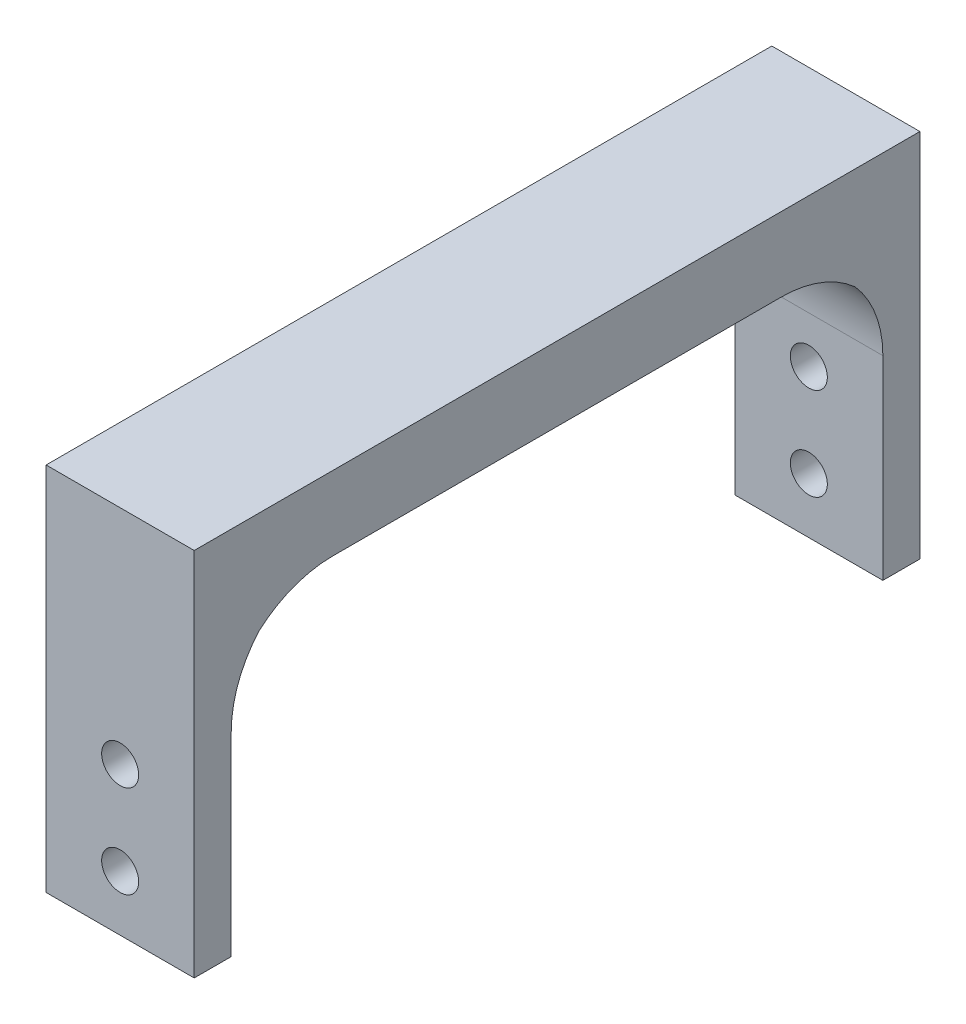
ISO-10303-21;
HEADER;
FILE_DESCRIPTION(('STEP AP214'),'2;1');
FILE_NAME('part.step','',(''),(''),'','','');
FILE_SCHEMA(('AUTOMOTIVE_DESIGN { 1 0 10303 214 1 1 1 1 }'));
ENDSEC;
DATA;
#1=APPLICATION_CONTEXT('core data for automotive mechanical design processes');
#2=APPLICATION_PROTOCOL_DEFINITION('international standard','automotive_design',2000,#1);
#3=PRODUCT_CONTEXT('',#1,'mechanical');
#4=PRODUCT('Part','Part','',(#3));
#5=PRODUCT_RELATED_PRODUCT_CATEGORY('part','',(#4));
#6=PRODUCT_DEFINITION_FORMATION('','',#4);
#7=PRODUCT_DEFINITION_CONTEXT('part definition',#1,'design');
#8=PRODUCT_DEFINITION('design','',#6,#7);
#9=PRODUCT_DEFINITION_SHAPE('','',#8);
#10=(LENGTH_UNIT() NAMED_UNIT(*) SI_UNIT(.MILLI.,.METRE.));
#11=(NAMED_UNIT(*) PLANE_ANGLE_UNIT() SI_UNIT($,.RADIAN.));
#12=(NAMED_UNIT(*) SI_UNIT($,.STERADIAN.) SOLID_ANGLE_UNIT());
#13=UNCERTAINTY_MEASURE_WITH_UNIT(LENGTH_MEASURE(1.E-05),#10,'distance_accuracy_value','');
#14=(GEOMETRIC_REPRESENTATION_CONTEXT(3) GLOBAL_UNCERTAINTY_ASSIGNED_CONTEXT((#13)) GLOBAL_UNIT_ASSIGNED_CONTEXT((#10,
#11,#12)) REPRESENTATION_CONTEXT('',''));
#15=CARTESIAN_POINT('',(0.,0.,0.));
#16=DIRECTION('',(0.,0.,1.));
#17=DIRECTION('',(1.,0.,0.));
#18=AXIS2_PLACEMENT_3D('',#15,#16,#17);
#19=CARTESIAN_POINT('',(0.,40.,93.));
#20=DIRECTION('',(0.,1.,0.));
#21=DIRECTION('',(0.,0.,1.));
#22=AXIS2_PLACEMENT_3D('',#19,#20,#21);
#23=PLANE('',#22);
#24=DIRECTION('',(0.,0.,-1.));
#25=VECTOR('',#24,1.);
#26=CARTESIAN_POINT('',(3.49999999999999,40.,93.));
#27=LINE('',#26,#25);
#28=CARTESIAN_POINT('',(3.49999999999999,40.,79.2867965644036));
#29=VERTEX_POINT('',#28);
#30=CARTESIAN_POINT('',(3.49999999999999,40.,18.7132034355964));
#31=VERTEX_POINT('',#30);
#32=EDGE_CURVE('E226',#29,#31,#27,.T.);
#33=ORIENTED_EDGE('',*,*,#32,.F.);
#34=DIRECTION('',(1.,0.,0.));
#35=VECTOR('',#34,1.);
#36=CARTESIAN_POINT('',(0.,40.,79.2867965644036));
#37=LINE('',#36,#35);
#38=CARTESIAN_POINT('',(0.,40.,79.2867965644036));
#39=VERTEX_POINT('',#38);
#40=EDGE_CURVE('E374',#29,#39,#37,.F.);
#41=ORIENTED_EDGE('',*,*,#40,.T.);
#42=DIRECTION('',(0.,0.,-1.));
#43=VECTOR('',#42,1.);
#44=CARTESIAN_POINT('',(0.,40.,93.));
#45=LINE('',#44,#43);
#46=CARTESIAN_POINT('',(0.,40.,18.7132034355964));
#47=VERTEX_POINT('',#46);
#48=EDGE_CURVE('E321',#39,#47,#45,.T.);
#49=ORIENTED_EDGE('',*,*,#48,.T.);
#50=DIRECTION('',(1.,0.,0.));
#51=VECTOR('',#50,1.);
#52=CARTESIAN_POINT('',(0.,40.,18.7132034355964));
#53=LINE('',#52,#51);
#54=EDGE_CURVE('E277',#47,#31,#53,.T.);
#55=ORIENTED_EDGE('',*,*,#54,.T.);
#56=EDGE_LOOP('',(#33,#41,#49,#55));
#57=FACE_BOUND('',#56,.T.);
#58=ADVANCED_FACE('F33',(#57),#23,.F.);
#59=CARTESIAN_POINT('',(0.,0.,5.));
#60=DIRECTION('',(0.,0.,-1.));
#61=DIRECTION('',(-1.,0.,0.));
#62=AXIS2_PLACEMENT_3D('',#59,#60,#61);
#63=PLANE('',#62);
#64=CARTESIAN_POINT('',(10.,7.5,5.));
#65=DIRECTION('',(0.,0.,-1.));
#66=DIRECTION('',(-1.,0.,0.));
#67=AXIS2_PLACEMENT_3D('',#64,#65,#66);
#68=CIRCLE('',#67,2.5);
#69=CARTESIAN_POINT('',(7.5,7.5,5.));
#70=VERTEX_POINT('',#69);
#71=EDGE_CURVE('E355',#70,#70,#68,.T.);
#72=ORIENTED_EDGE('',*,*,#71,.T.);
#73=EDGE_LOOP('',(#72));
#74=FACE_BOUND('',#73,.T.);
#75=CARTESIAN_POINT('',(10.,20.,5.));
#76=DIRECTION('',(0.,0.,-1.));
#77=DIRECTION('',(-1.,0.,0.));
#78=AXIS2_PLACEMENT_3D('',#75,#76,#77);
#79=CIRCLE('',#78,2.5);
#80=CARTESIAN_POINT('',(7.5,20.,5.));
#81=VERTEX_POINT('',#80);
#82=EDGE_CURVE('E533',#81,#81,#79,.T.);
#83=ORIENTED_EDGE('',*,*,#82,.T.);
#84=EDGE_LOOP('',(#83));
#85=FACE_BOUND('',#84,.T.);
#86=DIRECTION('',(0.,1.,0.));
#87=VECTOR('',#86,1.);
#88=CARTESIAN_POINT('',(20.,0.,5.));
#89=LINE('',#88,#87);
#90=CARTESIAN_POINT('',(20.,0.,5.));
#91=VERTEX_POINT('',#90);
#92=CARTESIAN_POINT('',(20.,26.2867965644036,5.));
#93=VERTEX_POINT('',#92);
#94=EDGE_CURVE('E334',#91,#93,#89,.T.);
#95=ORIENTED_EDGE('',*,*,#94,.T.);
#96=DIRECTION('',(1.,0.,0.));
#97=VECTOR('',#96,1.);
#98=CARTESIAN_POINT('',(0.,26.2867965644036,5.));
#99=LINE('',#98,#97);
#100=CARTESIAN_POINT('',(0.,26.2867965644036,5.));
#101=VERTEX_POINT('',#100);
#102=EDGE_CURVE('E343',#93,#101,#99,.F.);
#103=ORIENTED_EDGE('',*,*,#102,.T.);
#104=DIRECTION('',(0.,-1.,0.));
#105=VECTOR('',#104,1.);
#106=CARTESIAN_POINT('',(0.,0.,5.));
#107=LINE('',#106,#105);
#108=CARTESIAN_POINT('',(0.,0.,5.));
#109=VERTEX_POINT('',#108);
#110=EDGE_CURVE('E339',#101,#109,#107,.T.);
#111=ORIENTED_EDGE('',*,*,#110,.T.);
#112=DIRECTION('',(1.,0.,0.));
#113=VECTOR('',#112,1.);
#114=CARTESIAN_POINT('',(0.,0.,5.));
#115=LINE('',#114,#113);
#116=EDGE_CURVE('E341',#109,#91,#115,.T.);
#117=ORIENTED_EDGE('',*,*,#116,.T.);
#118=EDGE_LOOP('',(#95,#103,#111,#117));
#119=FACE_BOUND('',#118,.T.);
#120=ADVANCED_FACE('F449',(#74,#85,#119),#63,.F.);
#121=CARTESIAN_POINT('',(0.,0.,5.));
#122=DIRECTION('',(1.,0.,0.));
#123=DIRECTION('',(0.,1.,0.));
#124=AXIS2_PLACEMENT_3D('',#121,#122,#123);
#125=PLANE('',#124);
#126=CARTESIAN_POINT('',(0.,26.2867965644036,20.));
#127=DIRECTION('',(1.,0.,0.));
#128=DIRECTION('',(0.,1.,0.));
#129=AXIS2_PLACEMENT_3D('',#126,#127,#128);
#130=CIRCLE('',#129,15.);
#131=CARTESIAN_POINT('',(0.,36.2304676902326,8.76953230976757));
#132=VERTEX_POINT('',#131);
#133=EDGE_CURVE('E284',#101,#132,#130,.T.);
#134=ORIENTED_EDGE('',*,*,#133,.T.);
#135=CARTESIAN_POINT('',(0.,25.,18.7132034355964));
#136=DIRECTION('',(1.,0.,0.));
#137=DIRECTION('',(0.,1.,0.));
#138=AXIS2_PLACEMENT_3D('',#135,#136,#137);
#139=CIRCLE('',#138,15.);
#140=EDGE_CURVE('E288',#132,#47,#139,.T.);
#141=ORIENTED_EDGE('',*,*,#140,.T.);
#142=ORIENTED_EDGE('',*,*,#48,.F.);
#143=CARTESIAN_POINT('',(0.,25.,79.2867965644036));
#144=DIRECTION('',(1.,0.,0.));
#145=DIRECTION('',(0.,1.,0.));
#146=AXIS2_PLACEMENT_3D('',#143,#144,#145);
#147=CIRCLE('',#146,15.);
#148=CARTESIAN_POINT('',(0.,36.2304676902325,89.2304676902325));
#149=VERTEX_POINT('',#148);
#150=EDGE_CURVE('E11',#39,#149,#147,.T.);
#151=ORIENTED_EDGE('',*,*,#150,.T.);
#152=CARTESIAN_POINT('',(0.,26.2867965644036,78.));
#153=DIRECTION('',(1.,0.,0.));
#154=DIRECTION('',(0.,1.,0.));
#155=AXIS2_PLACEMENT_3D('',#152,#153,#154);
#156=CIRCLE('',#155,15.);
#157=CARTESIAN_POINT('',(0.,26.2867965644036,93.));
#158=VERTEX_POINT('',#157);
#159=EDGE_CURVE('E292',#149,#158,#156,.T.);
#160=ORIENTED_EDGE('',*,*,#159,.T.);
#161=DIRECTION('',(0.,-1.,0.));
#162=VECTOR('',#161,1.);
#163=CARTESIAN_POINT('',(0.,50.,93.));
#164=LINE('',#163,#162);
#165=CARTESIAN_POINT('',(0.,0.,93.));
#166=VERTEX_POINT('',#165);
#167=EDGE_CURVE('E254',#158,#166,#164,.T.);
#168=ORIENTED_EDGE('',*,*,#167,.T.);
#169=DIRECTION('',(0.,0.,-1.));
#170=VECTOR('',#169,1.);
#171=CARTESIAN_POINT('',(0.,0.,98.));
#172=LINE('',#171,#170);
#173=CARTESIAN_POINT('',(0.,0.,98.));
#174=VERTEX_POINT('',#173);
#175=EDGE_CURVE('E322',#174,#166,#172,.T.);
#176=ORIENTED_EDGE('',*,*,#175,.F.);
#177=DIRECTION('',(0.,-1.,0.));
#178=VECTOR('',#177,1.);
#179=CARTESIAN_POINT('',(0.,50.,98.));
#180=LINE('',#179,#178);
#181=CARTESIAN_POINT('',(0.,50.,98.));
#182=VERTEX_POINT('',#181);
#183=EDGE_CURVE('E257',#182,#174,#180,.T.);
#184=ORIENTED_EDGE('',*,*,#183,.F.);
#185=DIRECTION('',(0.,0.,-1.));
#186=VECTOR('',#185,1.);
#187=CARTESIAN_POINT('',(0.,50.,5.));
#188=LINE('',#187,#186);
#189=CARTESIAN_POINT('',(0.,50.,0.));
#190=VERTEX_POINT('',#189);
#191=EDGE_CURVE('E360',#182,#190,#188,.T.);
#192=ORIENTED_EDGE('',*,*,#191,.T.);
#193=DIRECTION('',(0.,-1.,0.));
#194=VECTOR('',#193,1.);
#195=CARTESIAN_POINT('',(0.,0.,0.));
#196=LINE('',#195,#194);
#197=CARTESIAN_POINT('',(0.,0.,0.));
#198=VERTEX_POINT('',#197);
#199=EDGE_CURVE('E351',#190,#198,#196,.T.);
#200=ORIENTED_EDGE('',*,*,#199,.T.);
#201=DIRECTION('',(0.,0.,-1.));
#202=VECTOR('',#201,1.);
#203=CARTESIAN_POINT('',(0.,0.,5.));
#204=LINE('',#203,#202);
#205=EDGE_CURVE('E368',#109,#198,#204,.T.);
#206=ORIENTED_EDGE('',*,*,#205,.F.);
#207=ORIENTED_EDGE('',*,*,#110,.F.);
#208=EDGE_LOOP('',(#134,#141,#142,#151,#160,#168,#176,#184,#192,#200,#206,#207));
#209=FACE_BOUND('',#208,.T.);
#210=ADVANCED_FACE('F454',(#209),#125,.F.);
#211=CARTESIAN_POINT('',(0.,0.,5.));
#212=DIRECTION('',(0.,1.,0.));
#213=DIRECTION('',(0.,0.,1.));
#214=AXIS2_PLACEMENT_3D('',#211,#212,#213);
#215=PLANE('',#214);
#216=DIRECTION('',(1.,0.,0.));
#217=VECTOR('',#216,1.);
#218=CARTESIAN_POINT('',(0.,0.,0.));
#219=LINE('',#218,#217);
#220=CARTESIAN_POINT('',(20.,0.,0.));
#221=VERTEX_POINT('',#220);
#222=EDGE_CURVE('E354',#198,#221,#219,.T.);
#223=ORIENTED_EDGE('',*,*,#222,.T.);
#224=DIRECTION('',(0.,0.,-1.));
#225=VECTOR('',#224,1.);
#226=CARTESIAN_POINT('',(20.,0.,5.));
#227=LINE('',#226,#225);
#228=EDGE_CURVE('E366',#91,#221,#227,.T.);
#229=ORIENTED_EDGE('',*,*,#228,.F.);
#230=ORIENTED_EDGE('',*,*,#116,.F.);
#231=ORIENTED_EDGE('',*,*,#205,.T.);
#232=EDGE_LOOP('',(#223,#229,#230,#231));
#233=FACE_BOUND('',#232,.T.);
#234=ADVANCED_FACE('F489',(#233),#215,.F.);
#235=CARTESIAN_POINT('',(20.,0.,5.));
#236=DIRECTION('',(-1.,0.,0.));
#237=DIRECTION('',(0.,-1.,0.));
#238=AXIS2_PLACEMENT_3D('',#235,#236,#237);
#239=PLANE('',#238);
#240=CARTESIAN_POINT('',(20.,26.2867965644036,78.));
#241=DIRECTION('',(-1.,0.,0.));
#242=DIRECTION('',(0.,-1.,0.));
#243=AXIS2_PLACEMENT_3D('',#240,#241,#242);
#244=CIRCLE('',#243,15.);
#245=CARTESIAN_POINT('',(20.,26.2867965644036,93.));
#246=VERTEX_POINT('',#245);
#247=CARTESIAN_POINT('',(20.,36.2304676902325,89.2304676902325));
#248=VERTEX_POINT('',#247);
#249=EDGE_CURVE('E290',#246,#248,#244,.T.);
#250=ORIENTED_EDGE('',*,*,#249,.T.);
#251=CARTESIAN_POINT('',(20.,25.,79.2867965644036));
#252=DIRECTION('',(-1.,0.,0.));
#253=DIRECTION('',(0.,-1.,0.));
#254=AXIS2_PLACEMENT_3D('',#251,#252,#253);
#255=CIRCLE('',#254,15.);
#256=CARTESIAN_POINT('',(20.,40.,79.2867965644036));
#257=VERTEX_POINT('',#256);
#258=EDGE_CURVE('E42',#248,#257,#255,.T.);
#259=ORIENTED_EDGE('',*,*,#258,.T.);
#260=DIRECTION('',(0.,0.,-1.));
#261=VECTOR('',#260,1.);
#262=CARTESIAN_POINT('',(20.,40.,93.));
#263=LINE('',#262,#261);
#264=CARTESIAN_POINT('',(20.,40.,18.7132034355964));
#265=VERTEX_POINT('',#264);
#266=EDGE_CURVE('E314',#257,#265,#263,.T.);
#267=ORIENTED_EDGE('',*,*,#266,.T.);
#268=CARTESIAN_POINT('',(20.,25.,18.7132034355964));
#269=DIRECTION('',(-1.,0.,0.));
#270=DIRECTION('',(0.,-1.,0.));
#271=AXIS2_PLACEMENT_3D('',#268,#269,#270);
#272=CIRCLE('',#271,15.);
#273=CARTESIAN_POINT('',(20.,36.2304676902326,8.76953230976757));
#274=VERTEX_POINT('',#273);
#275=EDGE_CURVE('E286',#265,#274,#272,.T.);
#276=ORIENTED_EDGE('',*,*,#275,.T.);
#277=CARTESIAN_POINT('',(20.,26.2867965644036,20.));
#278=DIRECTION('',(-1.,0.,0.));
#279=DIRECTION('',(0.,-1.,0.));
#280=AXIS2_PLACEMENT_3D('',#277,#278,#279);
#281=CIRCLE('',#280,15.);
#282=EDGE_CURVE('E282',#274,#93,#281,.T.);
#283=ORIENTED_EDGE('',*,*,#282,.T.);
#284=ORIENTED_EDGE('',*,*,#94,.F.);
#285=ORIENTED_EDGE('',*,*,#228,.T.);
#286=DIRECTION('',(0.,1.,0.));
#287=VECTOR('',#286,1.);
#288=CARTESIAN_POINT('',(20.,0.,0.));
#289=LINE('',#288,#287);
#290=CARTESIAN_POINT('',(20.,50.,0.));
#291=VERTEX_POINT('',#290);
#292=EDGE_CURVE('E357',#221,#291,#289,.T.);
#293=ORIENTED_EDGE('',*,*,#292,.T.);
#294=DIRECTION('',(0.,0.,-1.));
#295=VECTOR('',#294,1.);
#296=CARTESIAN_POINT('',(20.,50.,5.));
#297=LINE('',#296,#295);
#298=CARTESIAN_POINT('',(20.,50.,98.));
#299=VERTEX_POINT('',#298);
#300=EDGE_CURVE('E363',#299,#291,#297,.T.);
#301=ORIENTED_EDGE('',*,*,#300,.F.);
#302=DIRECTION('',(0.,1.,0.));
#303=VECTOR('',#302,1.);
#304=CARTESIAN_POINT('',(20.,50.,98.));
#305=LINE('',#304,#303);
#306=CARTESIAN_POINT('',(20.,0.,98.));
#307=VERTEX_POINT('',#306);
#308=EDGE_CURVE('E263',#307,#299,#305,.T.);
#309=ORIENTED_EDGE('',*,*,#308,.F.);
#310=DIRECTION('',(0.,0.,-1.));
#311=VECTOR('',#310,1.);
#312=CARTESIAN_POINT('',(20.,0.,98.));
#313=LINE('',#312,#311);
#314=CARTESIAN_POINT('',(20.,0.,93.));
#315=VERTEX_POINT('',#314);
#316=EDGE_CURVE('E269',#307,#315,#313,.T.);
#317=ORIENTED_EDGE('',*,*,#316,.T.);
#318=DIRECTION('',(0.,1.,0.));
#319=VECTOR('',#318,1.);
#320=CARTESIAN_POINT('',(20.,50.,93.));
#321=LINE('',#320,#319);
#322=EDGE_CURVE('E261',#315,#246,#321,.T.);
#323=ORIENTED_EDGE('',*,*,#322,.T.);
#324=EDGE_LOOP('',(#250,#259,#267,#276,#283,#284,#285,#293,#301,#309,#317,#323));
#325=FACE_BOUND('',#324,.T.);
#326=ADVANCED_FACE('F313',(#325),#239,.F.);
#327=CARTESIAN_POINT('',(0.,50.,5.));
#328=DIRECTION('',(0.,-1.,0.));
#329=DIRECTION('',(0.,0.,-1.));
#330=AXIS2_PLACEMENT_3D('',#327,#328,#329);
#331=PLANE('',#330);
#332=DIRECTION('',(-1.,0.,0.));
#333=VECTOR('',#332,1.);
#334=CARTESIAN_POINT('',(0.,50.,0.));
#335=LINE('',#334,#333);
#336=EDGE_CURVE('E342',#291,#190,#335,.T.);
#337=ORIENTED_EDGE('',*,*,#336,.T.);
#338=ORIENTED_EDGE('',*,*,#191,.F.);
#339=DIRECTION('',(-1.,0.,0.));
#340=VECTOR('',#339,1.);
#341=CARTESIAN_POINT('',(0.,50.,98.));
#342=LINE('',#341,#340);
#343=EDGE_CURVE('E266',#299,#182,#342,.T.);
#344=ORIENTED_EDGE('',*,*,#343,.F.);
#345=ORIENTED_EDGE('',*,*,#300,.T.);
#346=EDGE_LOOP('',(#337,#338,#344,#345));
#347=FACE_BOUND('',#346,.T.);
#348=ADVANCED_FACE('F482',(#347),#331,.F.);
#349=CARTESIAN_POINT('',(0.,0.,0.));
#350=DIRECTION('',(0.,0.,-1.));
#351=DIRECTION('',(-1.,0.,0.));
#352=AXIS2_PLACEMENT_3D('',#349,#350,#351);
#353=PLANE('',#352);
#354=CARTESIAN_POINT('',(10.,20.,0.));
#355=DIRECTION('',(0.,0.,-1.));
#356=DIRECTION('',(-1.,0.,0.));
#357=AXIS2_PLACEMENT_3D('',#354,#355,#356);
#358=CIRCLE('',#357,2.5);
#359=CARTESIAN_POINT('',(7.5,20.,0.));
#360=VERTEX_POINT('',#359);
#361=EDGE_CURVE('E325',#360,#360,#358,.T.);
#362=ORIENTED_EDGE('',*,*,#361,.F.);
#363=EDGE_LOOP('',(#362));
#364=FACE_BOUND('',#363,.T.);
#365=CARTESIAN_POINT('',(10.,7.5,0.));
#366=DIRECTION('',(0.,0.,-1.));
#367=DIRECTION('',(-1.,0.,0.));
#368=AXIS2_PLACEMENT_3D('',#365,#366,#367);
#369=CIRCLE('',#368,2.5);
#370=CARTESIAN_POINT('',(7.5,7.5,0.));
#371=VERTEX_POINT('',#370);
#372=EDGE_CURVE('E347',#371,#371,#369,.T.);
#373=ORIENTED_EDGE('',*,*,#372,.F.);
#374=EDGE_LOOP('',(#373));
#375=FACE_BOUND('',#374,.T.);
#376=ORIENTED_EDGE('',*,*,#199,.F.);
#377=ORIENTED_EDGE('',*,*,#336,.F.);
#378=ORIENTED_EDGE('',*,*,#292,.F.);
#379=ORIENTED_EDGE('',*,*,#222,.F.);
#380=EDGE_LOOP('',(#376,#377,#378,#379));
#381=FACE_BOUND('',#380,.T.);
#382=ADVANCED_FACE('F474',(#364,#375,#381),#353,.T.);
#383=CARTESIAN_POINT('',(10.,7.5,5.));
#384=DIRECTION('',(0.,0.,-1.));
#385=DIRECTION('',(-1.,0.,0.));
#386=AXIS2_PLACEMENT_3D('',#383,#384,#385);
#387=CYLINDRICAL_SURFACE('',#386,2.5);
#388=ORIENTED_EDGE('',*,*,#71,.F.);
#389=EDGE_LOOP('',(#388));
#390=FACE_BOUND('',#389,.T.);
#391=ORIENTED_EDGE('',*,*,#372,.T.);
#392=EDGE_LOOP('',(#391));
#393=FACE_BOUND('',#392,.T.);
#394=ADVANCED_FACE('F469',(#390,#393),#387,.F.);
#395=CARTESIAN_POINT('',(10.,20.,5.));
#396=DIRECTION('',(0.,0.,-1.));
#397=DIRECTION('',(-1.,0.,0.));
#398=AXIS2_PLACEMENT_3D('',#395,#396,#397);
#399=CYLINDRICAL_SURFACE('',#398,2.5);
#400=ORIENTED_EDGE('',*,*,#82,.F.);
#401=EDGE_LOOP('',(#400));
#402=FACE_BOUND('',#401,.T.);
#403=ORIENTED_EDGE('',*,*,#361,.T.);
#404=EDGE_LOOP('',(#403));
#405=FACE_BOUND('',#404,.T.);
#406=ADVANCED_FACE('F461',(#402,#405),#399,.F.);
#407=CARTESIAN_POINT('',(16.5,40.,79.2867965644036));
#408=VERTEX_POINT('',#407);
#409=EDGE_CURVE('E309',#257,#408,#37,.F.);
#410=ORIENTED_EDGE('',*,*,#409,.T.);
#411=DIRECTION('',(0.,0.,-1.));
#412=VECTOR('',#411,1.);
#413=CARTESIAN_POINT('',(16.5,40.,5.));
#414=LINE('',#413,#412);
#415=CARTESIAN_POINT('',(16.5,40.,18.7132034355964));
#416=VERTEX_POINT('',#415);
#417=EDGE_CURVE('E223',#408,#416,#414,.T.);
#418=ORIENTED_EDGE('',*,*,#417,.T.);
#419=EDGE_CURVE('E320',#416,#265,#53,.T.);
#420=ORIENTED_EDGE('',*,*,#419,.T.);
#421=ORIENTED_EDGE('',*,*,#266,.F.);
#422=EDGE_LOOP('',(#410,#418,#420,#421));
#423=FACE_BOUND('',#422,.T.);
#424=ADVANCED_FACE('F318',(#423),#23,.F.);
#425=CARTESIAN_POINT('',(0.,0.,93.));
#426=DIRECTION('',(0.,0.,1.));
#427=DIRECTION('',(1.,0.,0.));
#428=AXIS2_PLACEMENT_3D('',#425,#426,#427);
#429=PLANE('',#428);
#430=CARTESIAN_POINT('',(9.99999999999998,20.,93.));
#431=DIRECTION('',(0.,0.,1.));
#432=DIRECTION('',(1.,0.,0.));
#433=AXIS2_PLACEMENT_3D('',#430,#431,#432);
#434=CIRCLE('',#433,2.5);
#435=CARTESIAN_POINT('',(12.5,20.,93.));
#436=VERTEX_POINT('',#435);
#437=EDGE_CURVE('E243',#436,#436,#434,.T.);
#438=ORIENTED_EDGE('',*,*,#437,.T.);
#439=EDGE_LOOP('',(#438));
#440=FACE_BOUND('',#439,.T.);
#441=CARTESIAN_POINT('',(9.99999999999999,7.5,93.));
#442=DIRECTION('',(0.,0.,1.));
#443=DIRECTION('',(1.,0.,0.));
#444=AXIS2_PLACEMENT_3D('',#441,#442,#443);
#445=CIRCLE('',#444,2.5);
#446=CARTESIAN_POINT('',(12.5,7.5,93.));
#447=VERTEX_POINT('',#446);
#448=EDGE_CURVE('E251',#447,#447,#445,.T.);
#449=ORIENTED_EDGE('',*,*,#448,.T.);
#450=EDGE_LOOP('',(#449));
#451=FACE_BOUND('',#450,.T.);
#452=ORIENTED_EDGE('',*,*,#167,.F.);
#453=DIRECTION('',(1.,0.,0.));
#454=VECTOR('',#453,1.);
#455=CARTESIAN_POINT('',(0.,26.2867965644036,93.));
#456=LINE('',#455,#454);
#457=EDGE_CURVE('E279',#158,#246,#456,.T.);
#458=ORIENTED_EDGE('',*,*,#457,.T.);
#459=ORIENTED_EDGE('',*,*,#322,.F.);
#460=DIRECTION('',(1.,0.,0.));
#461=VECTOR('',#460,1.);
#462=CARTESIAN_POINT('',(0.,0.,93.));
#463=LINE('',#462,#461);
#464=EDGE_CURVE('E272',#166,#315,#463,.T.);
#465=ORIENTED_EDGE('',*,*,#464,.F.);
#466=EDGE_LOOP('',(#452,#458,#459,#465));
#467=FACE_BOUND('',#466,.T.);
#468=ADVANCED_FACE('F460',(#440,#451,#467),#429,.F.);
#469=CARTESIAN_POINT('',(0.,0.,98.));
#470=DIRECTION('',(0.,1.,0.));
#471=DIRECTION('',(-1.,0.,0.));
#472=AXIS2_PLACEMENT_3D('',#469,#470,#471);
#473=PLANE('',#472);
#474=ORIENTED_EDGE('',*,*,#464,.T.);
#475=ORIENTED_EDGE('',*,*,#316,.F.);
#476=DIRECTION('',(1.,0.,0.));
#477=VECTOR('',#476,1.);
#478=CARTESIAN_POINT('',(0.,0.,98.));
#479=LINE('',#478,#477);
#480=EDGE_CURVE('E260',#174,#307,#479,.T.);
#481=ORIENTED_EDGE('',*,*,#480,.F.);
#482=ORIENTED_EDGE('',*,*,#175,.T.);
#483=EDGE_LOOP('',(#474,#475,#481,#482));
#484=FACE_BOUND('',#483,.T.);
#485=ADVANCED_FACE('F466',(#484),#473,.F.);
#486=CARTESIAN_POINT('',(0.,0.,98.));
#487=DIRECTION('',(0.,0.,1.));
#488=DIRECTION('',(1.,0.,0.));
#489=AXIS2_PLACEMENT_3D('',#486,#487,#488);
#490=PLANE('',#489);
#491=CARTESIAN_POINT('',(9.99999999999998,20.,98.));
#492=DIRECTION('',(0.,0.,1.));
#493=DIRECTION('',(1.,0.,0.));
#494=AXIS2_PLACEMENT_3D('',#491,#492,#493);
#495=CIRCLE('',#494,2.5);
#496=CARTESIAN_POINT('',(12.5,20.,98.));
#497=VERTEX_POINT('',#496);
#498=EDGE_CURVE('E247',#497,#497,#495,.T.);
#499=ORIENTED_EDGE('',*,*,#498,.F.);
#500=EDGE_LOOP('',(#499));
#501=FACE_BOUND('',#500,.T.);
#502=CARTESIAN_POINT('',(9.99999999999999,7.5,98.));
#503=DIRECTION('',(0.,0.,1.));
#504=DIRECTION('',(1.,0.,0.));
#505=AXIS2_PLACEMENT_3D('',#502,#503,#504);
#506=CIRCLE('',#505,2.5);
#507=CARTESIAN_POINT('',(12.5,7.5,98.));
#508=VERTEX_POINT('',#507);
#509=EDGE_CURVE('E246',#508,#508,#506,.T.);
#510=ORIENTED_EDGE('',*,*,#509,.F.);
#511=EDGE_LOOP('',(#510));
#512=FACE_BOUND('',#511,.T.);
#513=ORIENTED_EDGE('',*,*,#183,.T.);
#514=ORIENTED_EDGE('',*,*,#480,.T.);
#515=ORIENTED_EDGE('',*,*,#308,.T.);
#516=ORIENTED_EDGE('',*,*,#343,.T.);
#517=EDGE_LOOP('',(#513,#514,#515,#516));
#518=FACE_BOUND('',#517,.T.);
#519=ADVANCED_FACE('F508',(#501,#512,#518),#490,.T.);
#520=CARTESIAN_POINT('',(9.99999999999999,7.5,93.));
#521=DIRECTION('',(0.,0.,1.));
#522=DIRECTION('',(1.,0.,0.));
#523=AXIS2_PLACEMENT_3D('',#520,#521,#522);
#524=CYLINDRICAL_SURFACE('',#523,2.5);
#525=ORIENTED_EDGE('',*,*,#448,.F.);
#526=EDGE_LOOP('',(#525));
#527=FACE_BOUND('',#526,.T.);
#528=ORIENTED_EDGE('',*,*,#509,.T.);
#529=EDGE_LOOP('',(#528));
#530=FACE_BOUND('',#529,.T.);
#531=ADVANCED_FACE('F502',(#527,#530),#524,.F.);
#532=CARTESIAN_POINT('',(9.99999999999998,20.,93.));
#533=DIRECTION('',(0.,0.,1.));
#534=DIRECTION('',(1.,0.,0.));
#535=AXIS2_PLACEMENT_3D('',#532,#533,#534);
#536=CYLINDRICAL_SURFACE('',#535,2.5);
#537=ORIENTED_EDGE('',*,*,#437,.F.);
#538=EDGE_LOOP('',(#537));
#539=FACE_BOUND('',#538,.T.);
#540=ORIENTED_EDGE('',*,*,#498,.T.);
#541=EDGE_LOOP('',(#540));
#542=FACE_BOUND('',#541,.T.);
#543=ADVANCED_FACE('F498',(#539,#542),#536,.F.);
#544=CARTESIAN_POINT('',(0.,25.,18.7132034355964));
#545=DIRECTION('',(1.,0.,0.));
#546=DIRECTION('',(0.,0.,-1.));
#547=AXIS2_PLACEMENT_3D('',#544,#545,#546);
#548=CYLINDRICAL_SURFACE('',#547,15.);
#549=ORIENTED_EDGE('',*,*,#54,.F.);
#550=ORIENTED_EDGE('',*,*,#140,.F.);
#551=DIRECTION('',(1.,0.,0.));
#552=VECTOR('',#551,1.);
#553=CARTESIAN_POINT('',(9.99999999999999,36.2304676902326,8.76953230976757));
#554=LINE('',#553,#552);
#555=EDGE_CURVE('E250',#274,#132,#554,.F.);
#556=ORIENTED_EDGE('',*,*,#555,.F.);
#557=ORIENTED_EDGE('',*,*,#275,.F.);
#558=ORIENTED_EDGE('',*,*,#419,.F.);
#559=DIRECTION('',(1.,0.,0.));
#560=VECTOR('',#559,1.);
#561=CARTESIAN_POINT('',(0.,40.,18.7132034355964));
#562=LINE('',#561,#560);
#563=EDGE_CURVE('E387',#31,#416,#562,.T.);
#564=ORIENTED_EDGE('',*,*,#563,.F.);
#565=EDGE_LOOP('',(#549,#550,#556,#557,#558,#564));
#566=FACE_BOUND('',#565,.T.);
#567=ADVANCED_FACE('F386',(#566),#548,.F.);
#568=CARTESIAN_POINT('',(0.,26.2867965644036,20.));
#569=DIRECTION('',(1.,0.,0.));
#570=DIRECTION('',(0.,1.,0.));
#571=AXIS2_PLACEMENT_3D('',#568,#569,#570);
#572=CYLINDRICAL_SURFACE('',#571,15.);
#573=ORIENTED_EDGE('',*,*,#133,.F.);
#574=ORIENTED_EDGE('',*,*,#102,.F.);
#575=ORIENTED_EDGE('',*,*,#282,.F.);
#576=ORIENTED_EDGE('',*,*,#555,.T.);
#577=EDGE_LOOP('',(#573,#574,#575,#576));
#578=FACE_BOUND('',#577,.T.);
#579=ADVANCED_FACE('F494',(#578),#572,.F.);
#580=CARTESIAN_POINT('',(0.,25.,79.2867965644036));
#581=DIRECTION('',(1.,0.,0.));
#582=DIRECTION('',(0.,0.,-1.));
#583=AXIS2_PLACEMENT_3D('',#580,#581,#582);
#584=CYLINDRICAL_SURFACE('',#583,15.);
#585=DIRECTION('',(1.,0.,0.));
#586=VECTOR('',#585,1.);
#587=CARTESIAN_POINT('',(9.99999999999999,36.2304676902325,89.2304676902325));
#588=LINE('',#587,#586);
#589=EDGE_CURVE('E37',#149,#248,#588,.T.);
#590=ORIENTED_EDGE('',*,*,#589,.F.);
#591=ORIENTED_EDGE('',*,*,#150,.F.);
#592=ORIENTED_EDGE('',*,*,#40,.F.);
#593=DIRECTION('',(1.,0.,0.));
#594=VECTOR('',#593,1.);
#595=CARTESIAN_POINT('',(0.,40.,79.2867965644036));
#596=LINE('',#595,#594);
#597=EDGE_CURVE('E389',#408,#29,#596,.F.);
#598=ORIENTED_EDGE('',*,*,#597,.F.);
#599=ORIENTED_EDGE('',*,*,#409,.F.);
#600=ORIENTED_EDGE('',*,*,#258,.F.);
#601=EDGE_LOOP('',(#590,#591,#592,#598,#599,#600));
#602=FACE_BOUND('',#601,.T.);
#603=ADVANCED_FACE('F35',(#602),#584,.F.);
#604=CARTESIAN_POINT('',(0.,26.2867965644036,78.));
#605=DIRECTION('',(1.,0.,0.));
#606=DIRECTION('',(0.,1.,0.));
#607=AXIS2_PLACEMENT_3D('',#604,#605,#606);
#608=CYLINDRICAL_SURFACE('',#607,15.);
#609=ORIENTED_EDGE('',*,*,#159,.F.);
#610=ORIENTED_EDGE('',*,*,#589,.T.);
#611=ORIENTED_EDGE('',*,*,#249,.F.);
#612=ORIENTED_EDGE('',*,*,#457,.F.);
#613=EDGE_LOOP('',(#609,#610,#611,#612));
#614=FACE_BOUND('',#613,.T.);
#615=ADVANCED_FACE('F301',(#614),#608,.F.);
#616=CARTESIAN_POINT('',(0.,40.,79.2867965644036));
#617=DIRECTION('',(0.,0.,1.));
#618=DIRECTION('',(1.,0.,0.));
#619=AXIS2_PLACEMENT_3D('',#616,#617,#618);
#620=PLANE('',#619);
#621=ORIENTED_EDGE('',*,*,#597,.T.);
#622=DIRECTION('',(0.,1.,0.));
#623=VECTOR('',#622,1.);
#624=CARTESIAN_POINT('',(3.49999999999999,40.,79.2867965644036));
#625=LINE('',#624,#623);
#626=CARTESIAN_POINT('',(3.49999999999999,43.5,79.2867965644036));
#627=VERTEX_POINT('',#626);
#628=EDGE_CURVE('E230',#627,#29,#625,.F.);
#629=ORIENTED_EDGE('',*,*,#628,.F.);
#630=DIRECTION('',(1.,0.,0.));
#631=VECTOR('',#630,1.);
#632=CARTESIAN_POINT('',(9.9999,43.5,79.2867965644036));
#633=LINE('',#632,#631);
#634=CARTESIAN_POINT('',(16.5,43.5,79.2867965644036));
#635=VERTEX_POINT('',#634);
#636=EDGE_CURVE('E221',#635,#627,#633,.F.);
#637=ORIENTED_EDGE('',*,*,#636,.F.);
#638=DIRECTION('',(0.,-1.,0.));
#639=VECTOR('',#638,1.);
#640=CARTESIAN_POINT('',(16.5,40.,79.2867965644036));
#641=LINE('',#640,#639);
#642=EDGE_CURVE('E50',#635,#408,#641,.T.);
#643=ORIENTED_EDGE('',*,*,#642,.T.);
#644=EDGE_LOOP('',(#621,#629,#637,#643));
#645=FACE_BOUND('',#644,.T.);
#646=ADVANCED_FACE('F438',(#645),#620,.F.);
#647=CARTESIAN_POINT('',(0.,40.,18.7132034355964));
#648=DIRECTION('',(0.,0.,1.));
#649=DIRECTION('',(1.,0.,0.));
#650=AXIS2_PLACEMENT_3D('',#647,#648,#649);
#651=PLANE('',#650);
#652=ORIENTED_EDGE('',*,*,#563,.T.);
#653=DIRECTION('',(0.,-1.,0.));
#654=VECTOR('',#653,1.);
#655=CARTESIAN_POINT('',(16.5,40.,18.7132034355964));
#656=LINE('',#655,#654);
#657=CARTESIAN_POINT('',(16.5,43.5,18.7132034355964));
#658=VERTEX_POINT('',#657);
#659=EDGE_CURVE('E233',#658,#416,#656,.T.);
#660=ORIENTED_EDGE('',*,*,#659,.F.);
#661=DIRECTION('',(1.,0.,0.));
#662=VECTOR('',#661,1.);
#663=CARTESIAN_POINT('',(9.99998356010127,43.5,18.7132034355964));
#664=LINE('',#663,#662);
#665=CARTESIAN_POINT('',(3.49999999999999,43.5,18.7132034355964));
#666=VERTEX_POINT('',#665);
#667=EDGE_CURVE('E219',#666,#658,#664,.T.);
#668=ORIENTED_EDGE('',*,*,#667,.F.);
#669=DIRECTION('',(0.,-1.,0.));
#670=VECTOR('',#669,1.);
#671=CARTESIAN_POINT('',(3.5,0.,18.7132034355964));
#672=LINE('',#671,#670);
#673=EDGE_CURVE('E201',#666,#31,#672,.T.);
#674=ORIENTED_EDGE('',*,*,#673,.T.);
#675=EDGE_LOOP('',(#652,#660,#668,#674));
#676=FACE_BOUND('',#675,.T.);
#677=ADVANCED_FACE('F440',(#676),#651,.T.);
#678=CARTESIAN_POINT('',(3.5,0.,5.));
#679=DIRECTION('',(1.,0.,0.));
#680=DIRECTION('',(0.,1.,0.));
#681=AXIS2_PLACEMENT_3D('',#678,#679,#680);
#682=PLANE('',#681);
#683=DIRECTION('',(0.,-1.,0.));
#684=VECTOR('',#683,1.);
#685=CARTESIAN_POINT('',(3.5,0.,3.5));
#686=LINE('',#685,#684);
#687=CARTESIAN_POINT('',(3.49999999999999,46.5,3.5));
#688=VERTEX_POINT('',#687);
#689=CARTESIAN_POINT('',(3.49999999999999,34.6533968297443,3.5));
#690=VERTEX_POINT('',#689);
#691=EDGE_CURVE('E235',#688,#690,#686,.T.);
#692=ORIENTED_EDGE('',*,*,#691,.F.);
#693=DIRECTION('',(0.,0.,-1.));
#694=VECTOR('',#693,1.);
#695=CARTESIAN_POINT('',(3.49999999999999,46.5,5.));
#696=LINE('',#695,#694);
#697=CARTESIAN_POINT('',(3.49999999999999,46.5,94.5));
#698=VERTEX_POINT('',#697);
#699=EDGE_CURVE('E400',#698,#688,#696,.T.);
#700=ORIENTED_EDGE('',*,*,#699,.F.);
#701=DIRECTION('',(0.,-1.,0.));
#702=VECTOR('',#701,1.);
#703=CARTESIAN_POINT('',(3.5,0.,94.5));
#704=LINE('',#703,#702);
#705=CARTESIAN_POINT('',(3.49999999999999,34.6533968297443,94.5));
#706=VERTEX_POINT('',#705);
#707=EDGE_CURVE('E209',#698,#706,#704,.T.);
#708=ORIENTED_EDGE('',*,*,#707,.T.);
#709=CARTESIAN_POINT('',(3.49999999999999,26.2867965644036,78.));
#710=DIRECTION('',(1.,0.,0.));
#711=DIRECTION('',(0.,1.,0.));
#712=AXIS2_PLACEMENT_3D('',#709,#710,#711);
#713=CIRCLE('',#712,18.5);
#714=CARTESIAN_POINT('',(3.49999999999999,38.7090417279131,91.7090417279131));
#715=VERTEX_POINT('',#714);
#716=EDGE_CURVE('E397',#715,#706,#713,.T.);
#717=ORIENTED_EDGE('',*,*,#716,.F.);
#718=CARTESIAN_POINT('',(3.49999999999999,25.,79.2867965644036));
#719=DIRECTION('',(1.,0.,0.));
#720=DIRECTION('',(0.,1.,0.));
#721=AXIS2_PLACEMENT_3D('',#718,#719,#720);
#722=CIRCLE('',#721,18.5);
#723=EDGE_CURVE('E222',#627,#715,#722,.T.);
#724=ORIENTED_EDGE('',*,*,#723,.F.);
#725=ORIENTED_EDGE('',*,*,#628,.T.);
#726=ORIENTED_EDGE('',*,*,#32,.T.);
#727=ORIENTED_EDGE('',*,*,#673,.F.);
#728=CARTESIAN_POINT('',(3.49999999999999,25.,18.7132034355964));
#729=DIRECTION('',(1.,0.,0.));
#730=DIRECTION('',(0.,1.,0.));
#731=AXIS2_PLACEMENT_3D('',#728,#729,#730);
#732=CIRCLE('',#731,18.5);
#733=CARTESIAN_POINT('',(3.49999999999999,38.7090417279132,6.29095827208696));
#734=VERTEX_POINT('',#733);
#735=EDGE_CURVE('E198',#734,#666,#732,.T.);
#736=ORIENTED_EDGE('',*,*,#735,.F.);
#737=CARTESIAN_POINT('',(3.49999999999999,26.2867965644036,20.));
#738=DIRECTION('',(1.,0.,0.));
#739=DIRECTION('',(0.,1.,0.));
#740=AXIS2_PLACEMENT_3D('',#737,#738,#739);
#741=CIRCLE('',#740,18.5);
#742=EDGE_CURVE('E183',#690,#734,#741,.T.);
#743=ORIENTED_EDGE('',*,*,#742,.F.);
#744=EDGE_LOOP('',(#692,#700,#708,#717,#724,#725,#726,#727,#736,#743));
#745=FACE_BOUND('',#744,.T.);
#746=ADVANCED_FACE('F199',(#745),#682,.T.);
#747=CARTESIAN_POINT('',(16.5,0.,5.));
#748=DIRECTION('',(-1.,0.,0.));
#749=DIRECTION('',(0.,-1.,0.));
#750=AXIS2_PLACEMENT_3D('',#747,#748,#749);
#751=PLANE('',#750);
#752=DIRECTION('',(0.,1.,0.));
#753=VECTOR('',#752,1.);
#754=CARTESIAN_POINT('',(16.5,0.,94.5));
#755=LINE('',#754,#753);
#756=CARTESIAN_POINT('',(16.5,34.6533968297443,94.5));
#757=VERTEX_POINT('',#756);
#758=CARTESIAN_POINT('',(16.5,46.5,94.5));
#759=VERTEX_POINT('',#758);
#760=EDGE_CURVE('E213',#757,#759,#755,.T.);
#761=ORIENTED_EDGE('',*,*,#760,.T.);
#762=DIRECTION('',(0.,0.,-1.));
#763=VECTOR('',#762,1.);
#764=CARTESIAN_POINT('',(16.5,46.5,5.));
#765=LINE('',#764,#763);
#766=CARTESIAN_POINT('',(16.5,46.5,3.5));
#767=VERTEX_POINT('',#766);
#768=EDGE_CURVE('E392',#759,#767,#765,.T.);
#769=ORIENTED_EDGE('',*,*,#768,.T.);
#770=DIRECTION('',(0.,1.,0.));
#771=VECTOR('',#770,1.);
#772=CARTESIAN_POINT('',(16.5,0.,3.5));
#773=LINE('',#772,#771);
#774=CARTESIAN_POINT('',(16.5,34.6533968297443,3.5));
#775=VERTEX_POINT('',#774);
#776=EDGE_CURVE('E405',#775,#767,#773,.T.);
#777=ORIENTED_EDGE('',*,*,#776,.F.);
#778=CARTESIAN_POINT('',(16.5,26.2867965644036,20.));
#779=DIRECTION('',(-1.,0.,0.));
#780=DIRECTION('',(0.,-1.,0.));
#781=AXIS2_PLACEMENT_3D('',#778,#779,#780);
#782=CIRCLE('',#781,18.5);
#783=CARTESIAN_POINT('',(16.5,38.7090417279132,6.29095827208695));
#784=VERTEX_POINT('',#783);
#785=EDGE_CURVE('E195',#784,#775,#782,.T.);
#786=ORIENTED_EDGE('',*,*,#785,.F.);
#787=CARTESIAN_POINT('',(16.5,25.,18.7132034355964));
#788=DIRECTION('',(-1.,0.,0.));
#789=DIRECTION('',(0.,-1.,0.));
#790=AXIS2_PLACEMENT_3D('',#787,#788,#789);
#791=CIRCLE('',#790,18.5);
#792=EDGE_CURVE('E194',#658,#784,#791,.T.);
#793=ORIENTED_EDGE('',*,*,#792,.F.);
#794=ORIENTED_EDGE('',*,*,#659,.T.);
#795=ORIENTED_EDGE('',*,*,#417,.F.);
#796=ORIENTED_EDGE('',*,*,#642,.F.);
#797=CARTESIAN_POINT('',(16.5,25.,79.2867965644036));
#798=DIRECTION('',(-1.,0.,0.));
#799=DIRECTION('',(0.,-1.,0.));
#800=AXIS2_PLACEMENT_3D('',#797,#798,#799);
#801=CIRCLE('',#800,18.5);
#802=CARTESIAN_POINT('',(16.5,38.7090417279131,91.7090417279131));
#803=VERTEX_POINT('',#802);
#804=EDGE_CURVE('E396',#803,#635,#801,.T.);
#805=ORIENTED_EDGE('',*,*,#804,.F.);
#806=CARTESIAN_POINT('',(16.5,26.2867965644036,78.));
#807=DIRECTION('',(-1.,0.,0.));
#808=DIRECTION('',(0.,-1.,0.));
#809=AXIS2_PLACEMENT_3D('',#806,#807,#808);
#810=CIRCLE('',#809,18.5);
#811=EDGE_CURVE('E205',#757,#803,#810,.T.);
#812=ORIENTED_EDGE('',*,*,#811,.F.);
#813=EDGE_LOOP('',(#761,#769,#777,#786,#793,#794,#795,#796,#805,#812));
#814=FACE_BOUND('',#813,.T.);
#815=ADVANCED_FACE('F429',(#814),#751,.T.);
#816=CARTESIAN_POINT('',(0.,46.5,5.));
#817=DIRECTION('',(0.,-1.,0.));
#818=DIRECTION('',(0.,0.,-1.));
#819=AXIS2_PLACEMENT_3D('',#816,#817,#818);
#820=PLANE('',#819);
#821=DIRECTION('',(-1.,0.,0.));
#822=VECTOR('',#821,1.);
#823=CARTESIAN_POINT('',(0.,46.5,3.5));
#824=LINE('',#823,#822);
#825=EDGE_CURVE('E403',#767,#688,#824,.T.);
#826=ORIENTED_EDGE('',*,*,#825,.F.);
#827=ORIENTED_EDGE('',*,*,#768,.F.);
#828=DIRECTION('',(-1.,0.,0.));
#829=VECTOR('',#828,1.);
#830=CARTESIAN_POINT('',(0.,46.5,94.5));
#831=LINE('',#830,#829);
#832=EDGE_CURVE('E227',#759,#698,#831,.T.);
#833=ORIENTED_EDGE('',*,*,#832,.T.);
#834=ORIENTED_EDGE('',*,*,#699,.T.);
#835=EDGE_LOOP('',(#826,#827,#833,#834));
#836=FACE_BOUND('',#835,.T.);
#837=ADVANCED_FACE('F419',(#836),#820,.T.);
#838=CARTESIAN_POINT('',(0.,0.,3.5));
#839=DIRECTION('',(0.,0.,-1.));
#840=DIRECTION('',(-1.,0.,0.));
#841=AXIS2_PLACEMENT_3D('',#838,#839,#840);
#842=PLANE('',#841);
#843=DIRECTION('',(1.,0.,0.));
#844=VECTOR('',#843,1.);
#845=CARTESIAN_POINT('',(0.,34.6533968297443,3.5));
#846=LINE('',#845,#844);
#847=EDGE_CURVE('E190',#690,#775,#846,.T.);
#848=ORIENTED_EDGE('',*,*,#847,.T.);
#849=ORIENTED_EDGE('',*,*,#776,.T.);
#850=ORIENTED_EDGE('',*,*,#825,.T.);
#851=ORIENTED_EDGE('',*,*,#691,.T.);
#852=EDGE_LOOP('',(#848,#849,#850,#851));
#853=FACE_BOUND('',#852,.T.);
#854=ADVANCED_FACE('F426',(#853),#842,.F.);
#855=CARTESIAN_POINT('',(0.,0.,94.5));
#856=DIRECTION('',(0.,0.,1.));
#857=DIRECTION('',(1.,0.,0.));
#858=AXIS2_PLACEMENT_3D('',#855,#856,#857);
#859=PLANE('',#858);
#860=ORIENTED_EDGE('',*,*,#707,.F.);
#861=ORIENTED_EDGE('',*,*,#832,.F.);
#862=ORIENTED_EDGE('',*,*,#760,.F.);
#863=DIRECTION('',(1.,0.,0.));
#864=VECTOR('',#863,1.);
#865=CARTESIAN_POINT('',(0.,34.6533968297443,94.5));
#866=LINE('',#865,#864);
#867=EDGE_CURVE('E229',#706,#757,#866,.T.);
#868=ORIENTED_EDGE('',*,*,#867,.F.);
#869=EDGE_LOOP('',(#860,#861,#862,#868));
#870=FACE_BOUND('',#869,.T.);
#871=ADVANCED_FACE('F423',(#870),#859,.F.);
#872=CARTESIAN_POINT('',(0.,25.,18.7132034355964));
#873=DIRECTION('',(1.,0.,0.));
#874=DIRECTION('',(0.,0.,-1.));
#875=AXIS2_PLACEMENT_3D('',#872,#873,#874);
#876=CYLINDRICAL_SURFACE('',#875,18.5);
#877=ORIENTED_EDGE('',*,*,#667,.T.);
#878=ORIENTED_EDGE('',*,*,#792,.T.);
#879=DIRECTION('',(1.,0.,0.));
#880=VECTOR('',#879,1.);
#881=CARTESIAN_POINT('',(16.5,38.7090417279132,6.29095827208695));
#882=LINE('',#881,#880);
#883=EDGE_CURVE('E188',#784,#734,#882,.F.);
#884=ORIENTED_EDGE('',*,*,#883,.T.);
#885=ORIENTED_EDGE('',*,*,#735,.T.);
#886=EDGE_LOOP('',(#877,#878,#884,#885));
#887=FACE_BOUND('',#886,.T.);
#888=ADVANCED_FACE('F207',(#887),#876,.T.);
#889=CARTESIAN_POINT('',(0.,26.2867965644036,20.));
#890=DIRECTION('',(1.,0.,0.));
#891=DIRECTION('',(0.,1.,0.));
#892=AXIS2_PLACEMENT_3D('',#889,#890,#891);
#893=CYLINDRICAL_SURFACE('',#892,18.5);
#894=ORIENTED_EDGE('',*,*,#742,.T.);
#895=ORIENTED_EDGE('',*,*,#883,.F.);
#896=ORIENTED_EDGE('',*,*,#785,.T.);
#897=ORIENTED_EDGE('',*,*,#847,.F.);
#898=EDGE_LOOP('',(#894,#895,#896,#897));
#899=FACE_BOUND('',#898,.T.);
#900=ADVANCED_FACE('F185',(#899),#893,.T.);
#901=CARTESIAN_POINT('',(0.,25.,79.2867965644036));
#902=DIRECTION('',(1.,0.,0.));
#903=DIRECTION('',(0.,0.,-1.));
#904=AXIS2_PLACEMENT_3D('',#901,#902,#903);
#905=CYLINDRICAL_SURFACE('',#904,18.5);
#906=DIRECTION('',(1.,0.,0.));
#907=VECTOR('',#906,1.);
#908=CARTESIAN_POINT('',(3.49999999999999,38.7090417279131,91.7090417279131));
#909=LINE('',#908,#907);
#910=EDGE_CURVE('E210',#715,#803,#909,.T.);
#911=ORIENTED_EDGE('',*,*,#910,.T.);
#912=ORIENTED_EDGE('',*,*,#804,.T.);
#913=ORIENTED_EDGE('',*,*,#636,.T.);
#914=ORIENTED_EDGE('',*,*,#723,.T.);
#915=EDGE_LOOP('',(#911,#912,#913,#914));
#916=FACE_BOUND('',#915,.T.);
#917=ADVANCED_FACE('F437',(#916),#905,.T.);
#918=CARTESIAN_POINT('',(0.,26.2867965644036,78.));
#919=DIRECTION('',(1.,0.,0.));
#920=DIRECTION('',(0.,1.,0.));
#921=AXIS2_PLACEMENT_3D('',#918,#919,#920);
#922=CYLINDRICAL_SURFACE('',#921,18.5);
#923=ORIENTED_EDGE('',*,*,#867,.T.);
#924=ORIENTED_EDGE('',*,*,#811,.T.);
#925=ORIENTED_EDGE('',*,*,#910,.F.);
#926=ORIENTED_EDGE('',*,*,#716,.T.);
#927=EDGE_LOOP('',(#923,#924,#925,#926));
#928=FACE_BOUND('',#927,.T.);
#929=ADVANCED_FACE('F434',(#928),#922,.T.);
#930=CLOSED_SHELL('',(#58,#120,#210,#234,#326,#348,#382,#394,#406,#424,#468,#485,#519,#531,#543,
#567,#579,#603,#615,#646,#677,#746,#815,#837,#854,#871,#888,#900,#917,#929));
#931=MANIFOLD_SOLID_BREP('B2',#930);
#932=ADVANCED_BREP_SHAPE_REPRESENTATION('',(#18,#931),#14);
#933=SHAPE_DEFINITION_REPRESENTATION(#9,#932);
ENDSEC;
END-ISO-10303-21;
